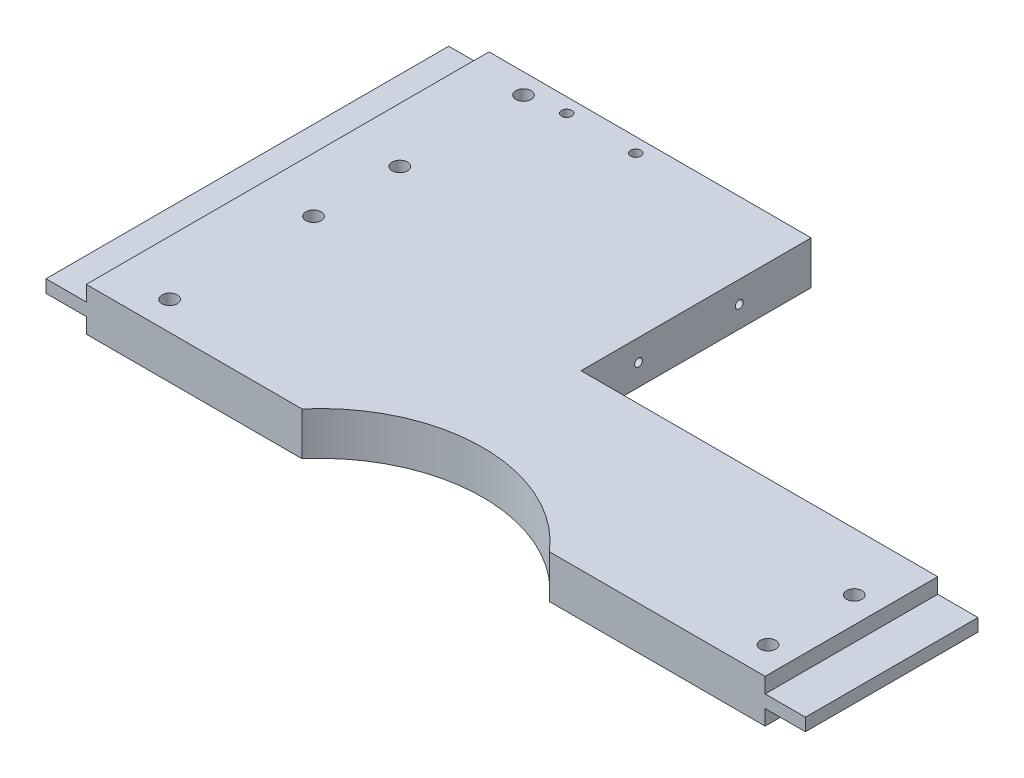
ISO-10303-21;
HEADER;
FILE_DESCRIPTION(('STEP AP214'),'2;1');
FILE_NAME('part.step','',(''),(''),'','','');
FILE_SCHEMA(('AUTOMOTIVE_DESIGN { 1 0 10303 214 1 1 1 1 }'));
ENDSEC;
DATA;
#1=APPLICATION_CONTEXT('core data for automotive mechanical design processes');
#2=APPLICATION_PROTOCOL_DEFINITION('international standard','automotive_design',2000,#1);
#3=PRODUCT_CONTEXT('',#1,'mechanical');
#4=PRODUCT('Part','Part','',(#3));
#5=PRODUCT_RELATED_PRODUCT_CATEGORY('part','',(#4));
#6=PRODUCT_DEFINITION_FORMATION('','',#4);
#7=PRODUCT_DEFINITION_CONTEXT('part definition',#1,'design');
#8=PRODUCT_DEFINITION('design','',#6,#7);
#9=PRODUCT_DEFINITION_SHAPE('','',#8);
#10=(LENGTH_UNIT() NAMED_UNIT(*) SI_UNIT(.MILLI.,.METRE.));
#11=(NAMED_UNIT(*) PLANE_ANGLE_UNIT() SI_UNIT($,.RADIAN.));
#12=(NAMED_UNIT(*) SI_UNIT($,.STERADIAN.) SOLID_ANGLE_UNIT());
#13=UNCERTAINTY_MEASURE_WITH_UNIT(LENGTH_MEASURE(1.E-05),#10,'distance_accuracy_value','');
#14=(GEOMETRIC_REPRESENTATION_CONTEXT(3) GLOBAL_UNCERTAINTY_ASSIGNED_CONTEXT((#13)) GLOBAL_UNIT_ASSIGNED_CONTEXT((#10,
#11,#12)) REPRESENTATION_CONTEXT('',''));
#15=CARTESIAN_POINT('',(0.,0.,0.));
#16=DIRECTION('',(0.,0.,1.));
#17=DIRECTION('',(1.,0.,0.));
#18=AXIS2_PLACEMENT_3D('',#15,#16,#17);
#19=CARTESIAN_POINT('',(157.48,9.525,0.));
#20=DIRECTION('',(1.,0.,0.));
#21=DIRECTION('',(0.,0.,-1.));
#22=AXIS2_PLACEMENT_3D('',#19,#20,#21);
#23=PLANE('',#22);
#24=DIRECTION('',(0.,-1.,0.));
#25=VECTOR('',#24,1.);
#26=CARTESIAN_POINT('',(157.48,9.525,0.));
#27=LINE('',#26,#25);
#28=CARTESIAN_POINT('',(157.48,-2.794,0.));
#29=VERTEX_POINT('',#28);
#30=CARTESIAN_POINT('',(157.48,-9.525,0.));
#31=VERTEX_POINT('',#30);
#32=EDGE_CURVE('E68',#29,#31,#27,.T.);
#33=ORIENTED_EDGE('',*,*,#32,.F.);
#34=DIRECTION('',(0.,0.,1.));
#35=VECTOR('',#34,1.);
#36=CARTESIAN_POINT('',(157.48,-2.794,0.));
#37=LINE('',#36,#35);
#38=CARTESIAN_POINT('',(157.48,-2.794,76.2));
#39=VERTEX_POINT('',#38);
#40=EDGE_CURVE('E63',#29,#39,#37,.T.);
#41=ORIENTED_EDGE('',*,*,#40,.T.);
#42=DIRECTION('',(0.,-1.,0.));
#43=VECTOR('',#42,1.);
#44=CARTESIAN_POINT('',(157.48,9.525,76.2));
#45=LINE('',#44,#43);
#46=CARTESIAN_POINT('',(157.48,-9.525,76.2));
#47=VERTEX_POINT('',#46);
#48=EDGE_CURVE('E447',#39,#47,#45,.T.);
#49=ORIENTED_EDGE('',*,*,#48,.T.);
#50=DIRECTION('',(0.,0.,1.));
#51=VECTOR('',#50,1.);
#52=CARTESIAN_POINT('',(157.48,-9.525,0.));
#53=LINE('',#52,#51);
#54=EDGE_CURVE('E404',#31,#47,#53,.T.);
#55=ORIENTED_EDGE('',*,*,#54,.F.);
#56=EDGE_LOOP('',(#33,#41,#49,#55));
#57=FACE_BOUND('',#56,.T.);
#58=ADVANCED_FACE('F47',(#57),#23,.T.);
#59=CARTESIAN_POINT('',(-142.24,9.525,0.));
#60=DIRECTION('',(1.,0.,0.));
#61=DIRECTION('',(0.,0.,-1.));
#62=AXIS2_PLACEMENT_3D('',#59,#60,#61);
#63=PLANE('',#62);
#64=DIRECTION('',(0.,0.,-1.));
#65=VECTOR('',#64,1.);
#66=CARTESIAN_POINT('',(-142.24,2.794,-101.6));
#67=LINE('',#66,#65);
#68=CARTESIAN_POINT('',(-142.24,2.794,76.2));
#69=VERTEX_POINT('',#68);
#70=CARTESIAN_POINT('',(-142.24,2.794,-101.6));
#71=VERTEX_POINT('',#70);
#72=EDGE_CURVE('E330',#69,#71,#67,.T.);
#73=ORIENTED_EDGE('',*,*,#72,.F.);
#74=DIRECTION('',(0.,-1.,0.));
#75=VECTOR('',#74,1.);
#76=CARTESIAN_POINT('',(-142.24,9.525,76.2));
#77=LINE('',#76,#75);
#78=CARTESIAN_POINT('',(-142.24,9.525,76.2));
#79=VERTEX_POINT('',#78);
#80=EDGE_CURVE('E430',#79,#69,#77,.T.);
#81=ORIENTED_EDGE('',*,*,#80,.F.);
#82=DIRECTION('',(0.,0.,1.));
#83=VECTOR('',#82,1.);
#84=CARTESIAN_POINT('',(-142.24,9.525,0.));
#85=LINE('',#84,#83);
#86=CARTESIAN_POINT('',(-142.24,9.525,-101.6));
#87=VERTEX_POINT('',#86);
#88=EDGE_CURVE('E390',#87,#79,#85,.T.);
#89=ORIENTED_EDGE('',*,*,#88,.F.);
#90=DIRECTION('',(0.,-1.,0.));
#91=VECTOR('',#90,1.);
#92=CARTESIAN_POINT('',(-142.24,9.525,-101.6));
#93=LINE('',#92,#91);
#94=EDGE_CURVE('E435',#87,#71,#93,.T.);
#95=ORIENTED_EDGE('',*,*,#94,.T.);
#96=EDGE_LOOP('',(#73,#81,#89,#95));
#97=FACE_BOUND('',#96,.T.);
#98=ADVANCED_FACE('F491',(#97),#63,.F.);
#99=CARTESIAN_POINT('',(7.62000000000005,9.525,122.820200991416));
#100=DIRECTION('',(0.,-1.,0.));
#101=DIRECTION('',(0.,0.,-1.));
#102=AXIS2_PLACEMENT_3D('',#99,#100,#101);
#103=CYLINDRICAL_SURFACE('',#102,71.8031701283446);
#104=CARTESIAN_POINT('',(7.62000000000005,-9.525,122.820200991416));
#105=DIRECTION('',(0.,1.,0.));
#106=DIRECTION('',(0.,0.,1.));
#107=AXIS2_PLACEMENT_3D('',#104,#105,#106);
#108=CIRCLE('',#107,71.8031701283446);
#109=CARTESIAN_POINT('',(62.23,-9.525,76.2));
#110=VERTEX_POINT('',#109);
#111=CARTESIAN_POINT('',(-46.99,-9.525,76.2));
#112=VERTEX_POINT('',#111);
#113=EDGE_CURVE('E364',#110,#112,#108,.T.);
#114=ORIENTED_EDGE('',*,*,#113,.F.);
#115=DIRECTION('',(0.,-1.,0.));
#116=VECTOR('',#115,1.);
#117=CARTESIAN_POINT('',(62.23,9.525,76.2));
#118=LINE('',#117,#116);
#119=CARTESIAN_POINT('',(62.23,9.525,76.2));
#120=VERTEX_POINT('',#119);
#121=EDGE_CURVE('E11',#120,#110,#118,.T.);
#122=ORIENTED_EDGE('',*,*,#121,.F.);
#123=CARTESIAN_POINT('',(7.62000000000005,9.525,122.820200991416));
#124=DIRECTION('',(0.,1.,0.));
#125=DIRECTION('',(0.,0.,1.));
#126=AXIS2_PLACEMENT_3D('',#123,#124,#125);
#127=CIRCLE('',#126,71.8031701283446);
#128=CARTESIAN_POINT('',(-46.99,9.525,76.2));
#129=VERTEX_POINT('',#128);
#130=EDGE_CURVE('E365',#120,#129,#127,.T.);
#131=ORIENTED_EDGE('',*,*,#130,.T.);
#132=DIRECTION('',(0.,-1.,0.));
#133=VECTOR('',#132,1.);
#134=CARTESIAN_POINT('',(-46.99,9.525,76.2));
#135=LINE('',#134,#133);
#136=EDGE_CURVE('E396',#129,#112,#135,.T.);
#137=ORIENTED_EDGE('',*,*,#136,.T.);
#138=EDGE_LOOP('',(#114,#122,#131,#137));
#139=FACE_BOUND('',#138,.T.);
#140=ADVANCED_FACE('F49',(#139),#103,.F.);
#141=CARTESIAN_POINT('',(0.,9.525,76.2));
#142=DIRECTION('',(0.,0.,1.));
#143=DIRECTION('',(1.,0.,0.));
#144=AXIS2_PLACEMENT_3D('',#141,#142,#143);
#145=PLANE('',#144);
#146=DIRECTION('',(-1.,0.,0.));
#147=VECTOR('',#146,1.);
#148=CARTESIAN_POINT('',(0.,-9.525,76.2));
#149=LINE('',#148,#147);
#150=EDGE_CURVE('E400',#47,#110,#149,.T.);
#151=ORIENTED_EDGE('',*,*,#150,.F.);
#152=ORIENTED_EDGE('',*,*,#48,.F.);
#153=DIRECTION('',(1.,0.,0.));
#154=VECTOR('',#153,1.);
#155=CARTESIAN_POINT('',(157.48,-2.794,76.2));
#156=LINE('',#155,#154);
#157=CARTESIAN_POINT('',(175.26,-2.794,76.2));
#158=VERTEX_POINT('',#157);
#159=EDGE_CURVE('E314',#39,#158,#156,.T.);
#160=ORIENTED_EDGE('',*,*,#159,.T.);
#161=DIRECTION('',(0.,-1.,0.));
#162=VECTOR('',#161,1.);
#163=CARTESIAN_POINT('',(175.26,2.794,76.2));
#164=LINE('',#163,#162);
#165=CARTESIAN_POINT('',(175.26,2.794,76.2));
#166=VERTEX_POINT('',#165);
#167=EDGE_CURVE('E325',#166,#158,#164,.T.);
#168=ORIENTED_EDGE('',*,*,#167,.F.);
#169=DIRECTION('',(1.,0.,0.));
#170=VECTOR('',#169,1.);
#171=CARTESIAN_POINT('',(157.48,2.794,76.2));
#172=LINE('',#171,#170);
#173=CARTESIAN_POINT('',(157.48,2.794,76.2));
#174=VERTEX_POINT('',#173);
#175=EDGE_CURVE('E300',#174,#166,#172,.T.);
#176=ORIENTED_EDGE('',*,*,#175,.F.);
#177=CARTESIAN_POINT('',(157.48,9.525,76.2));
#178=VERTEX_POINT('',#177);
#179=EDGE_CURVE('E56',#178,#174,#45,.T.);
#180=ORIENTED_EDGE('',*,*,#179,.F.);
#181=DIRECTION('',(-1.,0.,0.));
#182=VECTOR('',#181,1.);
#183=CARTESIAN_POINT('',(0.,9.525,76.2));
#184=LINE('',#183,#182);
#185=EDGE_CURVE('E369',#178,#120,#184,.T.);
#186=ORIENTED_EDGE('',*,*,#185,.T.);
#187=ORIENTED_EDGE('',*,*,#121,.T.);
#188=EDGE_LOOP('',(#151,#152,#160,#168,#176,#180,#186,#187));
#189=FACE_BOUND('',#188,.T.);
#190=ADVANCED_FACE('F455',(#189),#145,.T.);
#191=DIRECTION('',(0.,0.,1.));
#192=VECTOR('',#191,1.);
#193=CARTESIAN_POINT('',(157.48,2.794,0.));
#194=LINE('',#193,#192);
#195=CARTESIAN_POINT('',(157.48,2.794,0.));
#196=VERTEX_POINT('',#195);
#197=EDGE_CURVE('E296',#196,#174,#194,.T.);
#198=ORIENTED_EDGE('',*,*,#197,.F.);
#199=CARTESIAN_POINT('',(157.48,9.525,0.));
#200=VERTEX_POINT('',#199);
#201=EDGE_CURVE('E444',#200,#196,#27,.T.);
#202=ORIENTED_EDGE('',*,*,#201,.F.);
#203=DIRECTION('',(0.,0.,1.));
#204=VECTOR('',#203,1.);
#205=CARTESIAN_POINT('',(157.48,9.525,0.));
#206=LINE('',#205,#204);
#207=EDGE_CURVE('E374',#200,#178,#206,.T.);
#208=ORIENTED_EDGE('',*,*,#207,.T.);
#209=ORIENTED_EDGE('',*,*,#179,.T.);
#210=EDGE_LOOP('',(#198,#202,#208,#209));
#211=FACE_BOUND('',#210,.T.);
#212=ADVANCED_FACE('F519',(#211),#23,.T.);
#213=CARTESIAN_POINT('',(0.,9.525,0.));
#214=DIRECTION('',(0.,0.,-1.));
#215=DIRECTION('',(-1.,0.,0.));
#216=AXIS2_PLACEMENT_3D('',#213,#214,#215);
#217=PLANE('',#216);
#218=CARTESIAN_POINT('',(137.16,0.,0.));
#219=DIRECTION('',(0.,0.,-1.));
#220=DIRECTION('',(-1.,0.,0.));
#221=AXIS2_PLACEMENT_3D('',#218,#219,#220);
#222=CIRCLE('',#221,1.72719999999998);
#223=CARTESIAN_POINT('',(135.4328,0.,0.));
#224=VERTEX_POINT('',#223);
#225=EDGE_CURVE('E200',#224,#224,#222,.T.);
#226=ORIENTED_EDGE('',*,*,#225,.F.);
#227=EDGE_LOOP('',(#226));
#228=FACE_BOUND('',#227,.T.);
#229=CARTESIAN_POINT('',(106.68,0.,0.));
#230=DIRECTION('',(0.,0.,-1.));
#231=DIRECTION('',(-1.,0.,0.));
#232=AXIS2_PLACEMENT_3D('',#229,#230,#231);
#233=CIRCLE('',#232,1.72719999999998);
#234=CARTESIAN_POINT('',(104.9528,0.,0.));
#235=VERTEX_POINT('',#234);
#236=EDGE_CURVE('E208',#235,#235,#233,.T.);
#237=ORIENTED_EDGE('',*,*,#236,.F.);
#238=EDGE_LOOP('',(#237));
#239=FACE_BOUND('',#238,.T.);
#240=CARTESIAN_POINT('',(55.88,0.,0.));
#241=DIRECTION('',(0.,0.,-1.));
#242=DIRECTION('',(-1.,0.,0.));
#243=AXIS2_PLACEMENT_3D('',#240,#241,#242);
#244=CIRCLE('',#243,1.72719999999999);
#245=CARTESIAN_POINT('',(54.1528,0.,0.));
#246=VERTEX_POINT('',#245);
#247=EDGE_CURVE('E216',#246,#246,#244,.T.);
#248=ORIENTED_EDGE('',*,*,#247,.F.);
#249=EDGE_LOOP('',(#248));
#250=FACE_BOUND('',#249,.T.);
#251=CARTESIAN_POINT('',(15.24,0.,0.));
#252=DIRECTION('',(0.,0.,-1.));
#253=DIRECTION('',(-1.,0.,0.));
#254=AXIS2_PLACEMENT_3D('',#251,#252,#253);
#255=CIRCLE('',#254,1.72719999999999);
#256=CARTESIAN_POINT('',(13.5128,0.,0.));
#257=VERTEX_POINT('',#256);
#258=EDGE_CURVE('E224',#257,#257,#255,.T.);
#259=ORIENTED_EDGE('',*,*,#258,.F.);
#260=EDGE_LOOP('',(#259));
#261=FACE_BOUND('',#260,.T.);
#262=DIRECTION('',(1.,0.,0.));
#263=VECTOR('',#262,1.);
#264=CARTESIAN_POINT('',(0.,-9.525,0.));
#265=LINE('',#264,#263);
#266=CARTESIAN_POINT('',(0.,-9.525,0.));
#267=VERTEX_POINT('',#266);
#268=EDGE_CURVE('E408',#267,#31,#265,.T.);
#269=ORIENTED_EDGE('',*,*,#268,.F.);
#270=DIRECTION('',(0.,-1.,0.));
#271=VECTOR('',#270,1.);
#272=CARTESIAN_POINT('',(0.,9.525,0.));
#273=LINE('',#272,#271);
#274=CARTESIAN_POINT('',(0.,9.525,0.));
#275=VERTEX_POINT('',#274);
#276=EDGE_CURVE('E441',#275,#267,#273,.T.);
#277=ORIENTED_EDGE('',*,*,#276,.F.);
#278=DIRECTION('',(1.,0.,0.));
#279=VECTOR('',#278,1.);
#280=CARTESIAN_POINT('',(0.,9.525,0.));
#281=LINE('',#280,#279);
#282=EDGE_CURVE('E378',#275,#200,#281,.T.);
#283=ORIENTED_EDGE('',*,*,#282,.T.);
#284=ORIENTED_EDGE('',*,*,#201,.T.);
#285=DIRECTION('',(-1.,0.,0.));
#286=VECTOR('',#285,1.);
#287=CARTESIAN_POINT('',(157.48,2.794,0.));
#288=LINE('',#287,#286);
#289=CARTESIAN_POINT('',(175.26,2.794,0.));
#290=VERTEX_POINT('',#289);
#291=EDGE_CURVE('E307',#290,#196,#288,.T.);
#292=ORIENTED_EDGE('',*,*,#291,.F.);
#293=DIRECTION('',(0.,-1.,0.));
#294=VECTOR('',#293,1.);
#295=CARTESIAN_POINT('',(175.26,2.794,0.));
#296=LINE('',#295,#294);
#297=CARTESIAN_POINT('',(175.26,-2.794,0.));
#298=VERTEX_POINT('',#297);
#299=EDGE_CURVE('E311',#290,#298,#296,.T.);
#300=ORIENTED_EDGE('',*,*,#299,.T.);
#301=DIRECTION('',(-1.,0.,0.));
#302=VECTOR('',#301,1.);
#303=CARTESIAN_POINT('',(157.48,-2.794,0.));
#304=LINE('',#303,#302);
#305=EDGE_CURVE('E301',#298,#29,#304,.T.);
#306=ORIENTED_EDGE('',*,*,#305,.T.);
#307=ORIENTED_EDGE('',*,*,#32,.T.);
#308=EDGE_LOOP('',(#269,#277,#283,#284,#292,#300,#306,#307));
#309=FACE_BOUND('',#308,.T.);
#310=ADVANCED_FACE('F462',(#228,#239,#250,#261,#309),#217,.T.);
#311=CARTESIAN_POINT('',(0.,9.525,0.));
#312=DIRECTION('',(1.,0.,0.));
#313=DIRECTION('',(0.,0.,-1.));
#314=AXIS2_PLACEMENT_3D('',#311,#312,#313);
#315=PLANE('',#314);
#316=CARTESIAN_POINT('',(0.,0.,-69.85));
#317=DIRECTION('',(1.,0.,0.));
#318=DIRECTION('',(0.,0.,-1.));
#319=AXIS2_PLACEMENT_3D('',#316,#317,#318);
#320=CIRCLE('',#319,1.72719999999999);
#321=CARTESIAN_POINT('',(0.,0.,-71.5772));
#322=VERTEX_POINT('',#321);
#323=EDGE_CURVE('E187',#322,#322,#320,.T.);
#324=ORIENTED_EDGE('',*,*,#323,.F.);
#325=EDGE_LOOP('',(#324));
#326=FACE_BOUND('',#325,.T.);
#327=CARTESIAN_POINT('',(0.,0.,-25.4));
#328=DIRECTION('',(1.,0.,0.));
#329=DIRECTION('',(0.,0.,-1.));
#330=AXIS2_PLACEMENT_3D('',#327,#328,#329);
#331=CIRCLE('',#330,1.72719999999999);
#332=CARTESIAN_POINT('',(0.,0.,-27.1272));
#333=VERTEX_POINT('',#332);
#334=EDGE_CURVE('E186',#333,#333,#331,.T.);
#335=ORIENTED_EDGE('',*,*,#334,.F.);
#336=EDGE_LOOP('',(#335));
#337=FACE_BOUND('',#336,.T.);
#338=DIRECTION('',(0.,0.,1.));
#339=VECTOR('',#338,1.);
#340=CARTESIAN_POINT('',(0.,-9.525,0.));
#341=LINE('',#340,#339);
#342=CARTESIAN_POINT('',(0.,-9.525,-101.6));
#343=VERTEX_POINT('',#342);
#344=EDGE_CURVE('E412',#343,#267,#341,.T.);
#345=ORIENTED_EDGE('',*,*,#344,.F.);
#346=DIRECTION('',(0.,-1.,0.));
#347=VECTOR('',#346,1.);
#348=CARTESIAN_POINT('',(0.,9.525,-101.6));
#349=LINE('',#348,#347);
#350=CARTESIAN_POINT('',(0.,9.525,-101.6));
#351=VERTEX_POINT('',#350);
#352=EDGE_CURVE('E438',#351,#343,#349,.T.);
#353=ORIENTED_EDGE('',*,*,#352,.F.);
#354=DIRECTION('',(0.,0.,1.));
#355=VECTOR('',#354,1.);
#356=CARTESIAN_POINT('',(0.,9.525,0.));
#357=LINE('',#356,#355);
#358=EDGE_CURVE('E382',#351,#275,#357,.T.);
#359=ORIENTED_EDGE('',*,*,#358,.T.);
#360=ORIENTED_EDGE('',*,*,#276,.T.);
#361=EDGE_LOOP('',(#345,#353,#359,#360));
#362=FACE_BOUND('',#361,.T.);
#363=ADVANCED_FACE('F506',(#326,#337,#362),#315,.T.);
#364=CARTESIAN_POINT('',(0.,9.525,-101.6));
#365=DIRECTION('',(0.,0.,-1.));
#366=DIRECTION('',(-1.,0.,0.));
#367=AXIS2_PLACEMENT_3D('',#364,#365,#366);
#368=PLANE('',#367);
#369=DIRECTION('',(1.,0.,0.));
#370=VECTOR('',#369,1.);
#371=CARTESIAN_POINT('',(0.,-9.525,-101.6));
#372=LINE('',#371,#370);
#373=CARTESIAN_POINT('',(-142.24,-9.525,-101.6));
#374=VERTEX_POINT('',#373);
#375=EDGE_CURVE('E416',#374,#343,#372,.T.);
#376=ORIENTED_EDGE('',*,*,#375,.F.);
#377=CARTESIAN_POINT('',(-142.24,-2.794,-101.6));
#378=VERTEX_POINT('',#377);
#379=EDGE_CURVE('E434',#378,#374,#93,.T.);
#380=ORIENTED_EDGE('',*,*,#379,.F.);
#381=DIRECTION('',(-1.,0.,0.));
#382=VECTOR('',#381,1.);
#383=CARTESIAN_POINT('',(-142.24,-2.794,-101.6));
#384=LINE('',#383,#382);
#385=CARTESIAN_POINT('',(-160.02,-2.794,-101.6));
#386=VERTEX_POINT('',#385);
#387=EDGE_CURVE('E348',#378,#386,#384,.T.);
#388=ORIENTED_EDGE('',*,*,#387,.T.);
#389=DIRECTION('',(0.,-1.,0.));
#390=VECTOR('',#389,1.);
#391=CARTESIAN_POINT('',(-160.02,2.794,-101.6));
#392=LINE('',#391,#390);
#393=CARTESIAN_POINT('',(-160.02,2.794,-101.6));
#394=VERTEX_POINT('',#393);
#395=EDGE_CURVE('E360',#394,#386,#392,.T.);
#396=ORIENTED_EDGE('',*,*,#395,.F.);
#397=DIRECTION('',(-1.,0.,0.));
#398=VECTOR('',#397,1.);
#399=CARTESIAN_POINT('',(-142.24,2.794,-101.6));
#400=LINE('',#399,#398);
#401=EDGE_CURVE('E334',#71,#394,#400,.T.);
#402=ORIENTED_EDGE('',*,*,#401,.F.);
#403=ORIENTED_EDGE('',*,*,#94,.F.);
#404=DIRECTION('',(1.,0.,0.));
#405=VECTOR('',#404,1.);
#406=CARTESIAN_POINT('',(0.,9.525,-101.6));
#407=LINE('',#406,#405);
#408=EDGE_CURVE('E386',#87,#351,#407,.T.);
#409=ORIENTED_EDGE('',*,*,#408,.T.);
#410=ORIENTED_EDGE('',*,*,#352,.T.);
#411=EDGE_LOOP('',(#376,#380,#388,#396,#402,#403,#409,#410));
#412=FACE_BOUND('',#411,.T.);
#413=ADVANCED_FACE('F504',(#412),#368,.T.);
#414=CARTESIAN_POINT('',(-142.24,-2.794,76.2));
#415=VERTEX_POINT('',#414);
#416=CARTESIAN_POINT('',(-142.24,-9.525,76.2));
#417=VERTEX_POINT('',#416);
#418=EDGE_CURVE('E429',#415,#417,#77,.T.);
#419=ORIENTED_EDGE('',*,*,#418,.F.);
#420=DIRECTION('',(0.,0.,-1.));
#421=VECTOR('',#420,1.);
#422=CARTESIAN_POINT('',(-142.24,-2.794,-101.6));
#423=LINE('',#422,#421);
#424=EDGE_CURVE('E329',#415,#378,#423,.T.);
#425=ORIENTED_EDGE('',*,*,#424,.T.);
#426=ORIENTED_EDGE('',*,*,#379,.T.);
#427=DIRECTION('',(0.,0.,1.));
#428=VECTOR('',#427,1.);
#429=CARTESIAN_POINT('',(-142.24,-9.525,0.));
#430=LINE('',#429,#428);
#431=EDGE_CURVE('E420',#374,#417,#430,.T.);
#432=ORIENTED_EDGE('',*,*,#431,.T.);
#433=EDGE_LOOP('',(#419,#425,#426,#432));
#434=FACE_BOUND('',#433,.T.);
#435=ADVANCED_FACE('F476',(#434),#63,.F.);
#436=CARTESIAN_POINT('',(0.,9.525,76.2));
#437=DIRECTION('',(0.,0.,-1.));
#438=DIRECTION('',(-1.,0.,0.));
#439=AXIS2_PLACEMENT_3D('',#436,#437,#438);
#440=PLANE('',#439);
#441=DIRECTION('',(1.,0.,0.));
#442=VECTOR('',#441,1.);
#443=CARTESIAN_POINT('',(0.,-9.525,76.2));
#444=LINE('',#443,#442);
#445=EDGE_CURVE('E370',#417,#112,#444,.T.);
#446=ORIENTED_EDGE('',*,*,#445,.T.);
#447=ORIENTED_EDGE('',*,*,#136,.F.);
#448=DIRECTION('',(1.,0.,0.));
#449=VECTOR('',#448,1.);
#450=CARTESIAN_POINT('',(0.,9.525,76.2));
#451=LINE('',#450,#449);
#452=EDGE_CURVE('E393',#79,#129,#451,.T.);
#453=ORIENTED_EDGE('',*,*,#452,.F.);
#454=ORIENTED_EDGE('',*,*,#80,.T.);
#455=DIRECTION('',(1.,0.,0.));
#456=VECTOR('',#455,1.);
#457=CARTESIAN_POINT('',(-142.24,2.794,76.2000000000001));
#458=LINE('',#457,#456);
#459=CARTESIAN_POINT('',(-160.02,2.794,76.2));
#460=VERTEX_POINT('',#459);
#461=EDGE_CURVE('E341',#460,#69,#458,.T.);
#462=ORIENTED_EDGE('',*,*,#461,.F.);
#463=DIRECTION('',(0.,-1.,0.));
#464=VECTOR('',#463,1.);
#465=CARTESIAN_POINT('',(-160.02,2.794,76.2));
#466=LINE('',#465,#464);
#467=CARTESIAN_POINT('',(-160.02,-2.794,76.2));
#468=VERTEX_POINT('',#467);
#469=EDGE_CURVE('E345',#460,#468,#466,.T.);
#470=ORIENTED_EDGE('',*,*,#469,.T.);
#471=DIRECTION('',(1.,0.,0.));
#472=VECTOR('',#471,1.);
#473=CARTESIAN_POINT('',(-142.24,-2.794,76.2000000000001));
#474=LINE('',#473,#472);
#475=EDGE_CURVE('E335',#468,#415,#474,.T.);
#476=ORIENTED_EDGE('',*,*,#475,.T.);
#477=ORIENTED_EDGE('',*,*,#418,.T.);
#478=EDGE_LOOP('',(#446,#447,#453,#454,#462,#470,#476,#477));
#479=FACE_BOUND('',#478,.T.);
#480=ADVANCED_FACE('F469',(#479),#440,.F.);
#481=CARTESIAN_POINT('',(0.,9.525,0.));
#482=DIRECTION('',(0.,1.,0.));
#483=DIRECTION('',(0.,0.,1.));
#484=AXIS2_PLACEMENT_3D('',#481,#482,#483);
#485=PLANE('',#484);
#486=CARTESIAN_POINT('',(146.05,9.525,25.4));
#487=DIRECTION('',(0.,1.,0.));
#488=DIRECTION('',(0.,0.,1.));
#489=AXIS2_PLACEMENT_3D('',#486,#487,#488);
#490=CIRCLE('',#489,3.3782);
#491=CARTESIAN_POINT('',(146.05,9.525,28.7782));
#492=VERTEX_POINT('',#491);
#493=EDGE_CURVE('E232',#492,#492,#490,.T.);
#494=ORIENTED_EDGE('',*,*,#493,.F.);
#495=EDGE_LOOP('',(#494));
#496=FACE_BOUND('',#495,.T.);
#497=CARTESIAN_POINT('',(146.05,9.525,63.5));
#498=DIRECTION('',(0.,1.,0.));
#499=DIRECTION('',(0.,0.,1.));
#500=AXIS2_PLACEMENT_3D('',#497,#498,#499);
#501=CIRCLE('',#500,3.3782);
#502=CARTESIAN_POINT('',(146.05,9.525,66.8782));
#503=VERTEX_POINT('',#502);
#504=EDGE_CURVE('E240',#503,#503,#501,.T.);
#505=ORIENTED_EDGE('',*,*,#504,.F.);
#506=EDGE_LOOP('',(#505));
#507=FACE_BOUND('',#506,.T.);
#508=CARTESIAN_POINT('',(-101.6,9.525,-95.25));
#509=DIRECTION('',(0.,1.,0.));
#510=DIRECTION('',(0.,0.,1.));
#511=AXIS2_PLACEMENT_3D('',#508,#509,#510);
#512=CIRCLE('',#511,2.2479);
#513=CARTESIAN_POINT('',(-101.6,9.525,-93.0021));
#514=VERTEX_POINT('',#513);
#515=EDGE_CURVE('E248',#514,#514,#512,.T.);
#516=ORIENTED_EDGE('',*,*,#515,.F.);
#517=EDGE_LOOP('',(#516));
#518=FACE_BOUND('',#517,.T.);
#519=CARTESIAN_POINT('',(-71.12,9.525,-95.25));
#520=DIRECTION('',(0.,1.,0.));
#521=DIRECTION('',(0.,0.,1.));
#522=AXIS2_PLACEMENT_3D('',#519,#520,#521);
#523=CIRCLE('',#522,2.2479);
#524=CARTESIAN_POINT('',(-71.12,9.525,-93.0021));
#525=VERTEX_POINT('',#524);
#526=EDGE_CURVE('E256',#525,#525,#523,.T.);
#527=ORIENTED_EDGE('',*,*,#526,.F.);
#528=EDGE_LOOP('',(#527));
#529=FACE_BOUND('',#528,.T.);
#530=CARTESIAN_POINT('',(-118.11,9.525,-92.71));
#531=DIRECTION('',(0.,1.,0.));
#532=DIRECTION('',(0.,0.,1.));
#533=AXIS2_PLACEMENT_3D('',#530,#531,#532);
#534=CIRCLE('',#533,3.3782);
#535=CARTESIAN_POINT('',(-118.11,9.525,-89.3318));
#536=VERTEX_POINT('',#535);
#537=EDGE_CURVE('E264',#536,#536,#534,.T.);
#538=ORIENTED_EDGE('',*,*,#537,.F.);
#539=EDGE_LOOP('',(#538));
#540=FACE_BOUND('',#539,.T.);
#541=CARTESIAN_POINT('',(-118.11,9.525,-38.1));
#542=DIRECTION('',(0.,1.,0.));
#543=DIRECTION('',(0.,0.,1.));
#544=AXIS2_PLACEMENT_3D('',#541,#542,#543);
#545=CIRCLE('',#544,3.3782);
#546=CARTESIAN_POINT('',(-118.11,9.525,-34.7218));
#547=VERTEX_POINT('',#546);
#548=EDGE_CURVE('E272',#547,#547,#545,.T.);
#549=ORIENTED_EDGE('',*,*,#548,.F.);
#550=EDGE_LOOP('',(#549));
#551=FACE_BOUND('',#550,.T.);
#552=CARTESIAN_POINT('',(-118.11,9.525,0.));
#553=DIRECTION('',(0.,1.,0.));
#554=DIRECTION('',(0.,0.,1.));
#555=AXIS2_PLACEMENT_3D('',#552,#553,#554);
#556=CIRCLE('',#555,3.3782);
#557=CARTESIAN_POINT('',(-118.11,9.525,3.37820000000004));
#558=VERTEX_POINT('',#557);
#559=EDGE_CURVE('E280',#558,#558,#556,.T.);
#560=ORIENTED_EDGE('',*,*,#559,.F.);
#561=EDGE_LOOP('',(#560));
#562=FACE_BOUND('',#561,.T.);
#563=CARTESIAN_POINT('',(-118.11,9.525,63.5));
#564=DIRECTION('',(0.,1.,0.));
#565=DIRECTION('',(0.,0.,1.));
#566=AXIS2_PLACEMENT_3D('',#563,#564,#565);
#567=CIRCLE('',#566,3.3782);
#568=CARTESIAN_POINT('',(-118.11,9.525,66.8782));
#569=VERTEX_POINT('',#568);
#570=EDGE_CURVE('E288',#569,#569,#567,.T.);
#571=ORIENTED_EDGE('',*,*,#570,.F.);
#572=EDGE_LOOP('',(#571));
#573=FACE_BOUND('',#572,.T.);
#574=ORIENTED_EDGE('',*,*,#130,.F.);
#575=ORIENTED_EDGE('',*,*,#185,.F.);
#576=ORIENTED_EDGE('',*,*,#207,.F.);
#577=ORIENTED_EDGE('',*,*,#282,.F.);
#578=ORIENTED_EDGE('',*,*,#358,.F.);
#579=ORIENTED_EDGE('',*,*,#408,.F.);
#580=ORIENTED_EDGE('',*,*,#88,.T.);
#581=ORIENTED_EDGE('',*,*,#452,.T.);
#582=EDGE_LOOP('',(#574,#575,#576,#577,#578,#579,#580,#581));
#583=FACE_BOUND('',#582,.T.);
#584=ADVANCED_FACE('F485',(#496,#507,#518,#529,#540,#551,#562,#573,#583),#485,.T.);
#585=CARTESIAN_POINT('',(0.,-9.525,0.));
#586=DIRECTION('',(0.,1.,0.));
#587=DIRECTION('',(0.,0.,1.));
#588=AXIS2_PLACEMENT_3D('',#585,#586,#587);
#589=PLANE('',#588);
#590=CARTESIAN_POINT('',(146.05,-9.525,25.4));
#591=DIRECTION('',(0.,1.,0.));
#592=DIRECTION('',(0.,0.,1.));
#593=AXIS2_PLACEMENT_3D('',#590,#591,#592);
#594=CIRCLE('',#593,3.3782);
#595=CARTESIAN_POINT('',(146.05,-9.525,28.7782));
#596=VERTEX_POINT('',#595);
#597=EDGE_CURVE('E236',#596,#596,#594,.T.);
#598=ORIENTED_EDGE('',*,*,#597,.T.);
#599=EDGE_LOOP('',(#598));
#600=FACE_BOUND('',#599,.T.);
#601=CARTESIAN_POINT('',(146.05,-9.525,63.5));
#602=DIRECTION('',(0.,1.,0.));
#603=DIRECTION('',(0.,0.,1.));
#604=AXIS2_PLACEMENT_3D('',#601,#602,#603);
#605=CIRCLE('',#604,3.3782);
#606=CARTESIAN_POINT('',(146.05,-9.525,66.8782));
#607=VERTEX_POINT('',#606);
#608=EDGE_CURVE('E244',#607,#607,#605,.T.);
#609=ORIENTED_EDGE('',*,*,#608,.T.);
#610=EDGE_LOOP('',(#609));
#611=FACE_BOUND('',#610,.T.);
#612=CARTESIAN_POINT('',(-101.6,-9.525,-95.25));
#613=DIRECTION('',(0.,1.,0.));
#614=DIRECTION('',(0.,0.,1.));
#615=AXIS2_PLACEMENT_3D('',#612,#613,#614);
#616=CIRCLE('',#615,2.2479);
#617=CARTESIAN_POINT('',(-101.6,-9.525,-93.0021));
#618=VERTEX_POINT('',#617);
#619=EDGE_CURVE('E252',#618,#618,#616,.T.);
#620=ORIENTED_EDGE('',*,*,#619,.T.);
#621=EDGE_LOOP('',(#620));
#622=FACE_BOUND('',#621,.T.);
#623=CARTESIAN_POINT('',(-71.12,-9.525,-95.25));
#624=DIRECTION('',(0.,1.,0.));
#625=DIRECTION('',(0.,0.,1.));
#626=AXIS2_PLACEMENT_3D('',#623,#624,#625);
#627=CIRCLE('',#626,2.2479);
#628=CARTESIAN_POINT('',(-71.12,-9.525,-93.0021));
#629=VERTEX_POINT('',#628);
#630=EDGE_CURVE('E260',#629,#629,#627,.T.);
#631=ORIENTED_EDGE('',*,*,#630,.T.);
#632=EDGE_LOOP('',(#631));
#633=FACE_BOUND('',#632,.T.);
#634=CARTESIAN_POINT('',(-118.11,-9.525,-92.71));
#635=DIRECTION('',(0.,1.,0.));
#636=DIRECTION('',(0.,0.,1.));
#637=AXIS2_PLACEMENT_3D('',#634,#635,#636);
#638=CIRCLE('',#637,3.3782);
#639=CARTESIAN_POINT('',(-118.11,-9.525,-89.3318));
#640=VERTEX_POINT('',#639);
#641=EDGE_CURVE('E268',#640,#640,#638,.T.);
#642=ORIENTED_EDGE('',*,*,#641,.T.);
#643=EDGE_LOOP('',(#642));
#644=FACE_BOUND('',#643,.T.);
#645=CARTESIAN_POINT('',(-118.11,-9.525,-38.1));
#646=DIRECTION('',(0.,1.,0.));
#647=DIRECTION('',(0.,0.,1.));
#648=AXIS2_PLACEMENT_3D('',#645,#646,#647);
#649=CIRCLE('',#648,3.3782);
#650=CARTESIAN_POINT('',(-118.11,-9.525,-34.7218));
#651=VERTEX_POINT('',#650);
#652=EDGE_CURVE('E276',#651,#651,#649,.T.);
#653=ORIENTED_EDGE('',*,*,#652,.T.);
#654=EDGE_LOOP('',(#653));
#655=FACE_BOUND('',#654,.T.);
#656=CARTESIAN_POINT('',(-118.11,-9.525,0.));
#657=DIRECTION('',(0.,1.,0.));
#658=DIRECTION('',(0.,0.,1.));
#659=AXIS2_PLACEMENT_3D('',#656,#657,#658);
#660=CIRCLE('',#659,3.3782);
#661=CARTESIAN_POINT('',(-118.11,-9.525,3.37820000000004));
#662=VERTEX_POINT('',#661);
#663=EDGE_CURVE('E284',#662,#662,#660,.T.);
#664=ORIENTED_EDGE('',*,*,#663,.T.);
#665=EDGE_LOOP('',(#664));
#666=FACE_BOUND('',#665,.T.);
#667=CARTESIAN_POINT('',(-118.11,-9.525,63.5));
#668=DIRECTION('',(0.,1.,0.));
#669=DIRECTION('',(0.,0.,1.));
#670=AXIS2_PLACEMENT_3D('',#667,#668,#669);
#671=CIRCLE('',#670,3.3782);
#672=CARTESIAN_POINT('',(-118.11,-9.525,66.8782));
#673=VERTEX_POINT('',#672);
#674=EDGE_CURVE('E292',#673,#673,#671,.T.);
#675=ORIENTED_EDGE('',*,*,#674,.T.);
#676=EDGE_LOOP('',(#675));
#677=FACE_BOUND('',#676,.T.);
#678=ORIENTED_EDGE('',*,*,#113,.T.);
#679=ORIENTED_EDGE('',*,*,#445,.F.);
#680=ORIENTED_EDGE('',*,*,#431,.F.);
#681=ORIENTED_EDGE('',*,*,#375,.T.);
#682=ORIENTED_EDGE('',*,*,#344,.T.);
#683=ORIENTED_EDGE('',*,*,#268,.T.);
#684=ORIENTED_EDGE('',*,*,#54,.T.);
#685=ORIENTED_EDGE('',*,*,#150,.T.);
#686=EDGE_LOOP('',(#678,#679,#680,#681,#682,#683,#684,#685));
#687=FACE_BOUND('',#686,.T.);
#688=ADVANCED_FACE('F458',(#600,#611,#622,#633,#644,#655,#666,#677,#687),#589,.F.);
#689=CARTESIAN_POINT('',(-160.02,2.794,-101.6));
#690=DIRECTION('',(1.,0.,0.));
#691=DIRECTION('',(0.,0.,-1.));
#692=AXIS2_PLACEMENT_3D('',#689,#690,#691);
#693=PLANE('',#692);
#694=DIRECTION('',(0.,0.,1.));
#695=VECTOR('',#694,1.);
#696=CARTESIAN_POINT('',(-160.02,-2.794,-101.6));
#697=LINE('',#696,#695);
#698=EDGE_CURVE('E351',#386,#468,#697,.T.);
#699=ORIENTED_EDGE('',*,*,#698,.T.);
#700=ORIENTED_EDGE('',*,*,#469,.F.);
#701=DIRECTION('',(0.,0.,1.));
#702=VECTOR('',#701,1.);
#703=CARTESIAN_POINT('',(-160.02,2.794,-101.6));
#704=LINE('',#703,#702);
#705=EDGE_CURVE('E338',#394,#460,#704,.T.);
#706=ORIENTED_EDGE('',*,*,#705,.F.);
#707=ORIENTED_EDGE('',*,*,#395,.T.);
#708=EDGE_LOOP('',(#699,#700,#706,#707));
#709=FACE_BOUND('',#708,.T.);
#710=ADVANCED_FACE('F638',(#709),#693,.F.);
#711=CARTESIAN_POINT('',(0.,2.794,0.));
#712=DIRECTION('',(0.,-1.,0.));
#713=DIRECTION('',(0.,0.,-1.));
#714=AXIS2_PLACEMENT_3D('',#711,#712,#713);
#715=PLANE('',#714);
#716=ORIENTED_EDGE('',*,*,#72,.T.);
#717=ORIENTED_EDGE('',*,*,#401,.T.);
#718=ORIENTED_EDGE('',*,*,#705,.T.);
#719=ORIENTED_EDGE('',*,*,#461,.T.);
#720=EDGE_LOOP('',(#716,#717,#718,#719));
#721=FACE_BOUND('',#720,.T.);
#722=ADVANCED_FACE('F494',(#721),#715,.F.);
#723=CARTESIAN_POINT('',(0.,-2.794,0.));
#724=DIRECTION('',(0.,-1.,0.));
#725=DIRECTION('',(0.,0.,-1.));
#726=AXIS2_PLACEMENT_3D('',#723,#724,#725);
#727=PLANE('',#726);
#728=ORIENTED_EDGE('',*,*,#424,.F.);
#729=ORIENTED_EDGE('',*,*,#475,.F.);
#730=ORIENTED_EDGE('',*,*,#698,.F.);
#731=ORIENTED_EDGE('',*,*,#387,.F.);
#732=EDGE_LOOP('',(#728,#729,#730,#731));
#733=FACE_BOUND('',#732,.T.);
#734=ADVANCED_FACE('F501',(#733),#727,.T.);
#735=CARTESIAN_POINT('',(175.26,2.794,0.));
#736=DIRECTION('',(-1.,0.,0.));
#737=DIRECTION('',(0.,0.,1.));
#738=AXIS2_PLACEMENT_3D('',#735,#736,#737);
#739=PLANE('',#738);
#740=DIRECTION('',(0.,0.,-1.));
#741=VECTOR('',#740,1.);
#742=CARTESIAN_POINT('',(175.26,-2.794,0.));
#743=LINE('',#742,#741);
#744=EDGE_CURVE('E317',#158,#298,#743,.T.);
#745=ORIENTED_EDGE('',*,*,#744,.T.);
#746=ORIENTED_EDGE('',*,*,#299,.F.);
#747=DIRECTION('',(0.,0.,-1.));
#748=VECTOR('',#747,1.);
#749=CARTESIAN_POINT('',(175.26,2.794,0.));
#750=LINE('',#749,#748);
#751=EDGE_CURVE('E304',#166,#290,#750,.T.);
#752=ORIENTED_EDGE('',*,*,#751,.F.);
#753=ORIENTED_EDGE('',*,*,#167,.T.);
#754=EDGE_LOOP('',(#745,#746,#752,#753));
#755=FACE_BOUND('',#754,.T.);
#756=ADVANCED_FACE('F515',(#755),#739,.F.);
#757=CARTESIAN_POINT('',(0.,2.794,0.));
#758=DIRECTION('',(0.,1.,0.));
#759=DIRECTION('',(0.,0.,1.));
#760=AXIS2_PLACEMENT_3D('',#757,#758,#759);
#761=PLANE('',#760);
#762=ORIENTED_EDGE('',*,*,#197,.T.);
#763=ORIENTED_EDGE('',*,*,#175,.T.);
#764=ORIENTED_EDGE('',*,*,#751,.T.);
#765=ORIENTED_EDGE('',*,*,#291,.T.);
#766=EDGE_LOOP('',(#762,#763,#764,#765));
#767=FACE_BOUND('',#766,.T.);
#768=ADVANCED_FACE('F510',(#767),#761,.T.);
#769=CARTESIAN_POINT('',(0.,-2.794,0.));
#770=DIRECTION('',(0.,1.,0.));
#771=DIRECTION('',(0.,0.,1.));
#772=AXIS2_PLACEMENT_3D('',#769,#770,#771);
#773=PLANE('',#772);
#774=ORIENTED_EDGE('',*,*,#40,.F.);
#775=ORIENTED_EDGE('',*,*,#305,.F.);
#776=ORIENTED_EDGE('',*,*,#744,.F.);
#777=ORIENTED_EDGE('',*,*,#159,.F.);
#778=EDGE_LOOP('',(#774,#775,#776,#777));
#779=FACE_BOUND('',#778,.T.);
#780=ADVANCED_FACE('F518',(#779),#773,.F.);
#781=CARTESIAN_POINT('',(-118.11,9.525,63.5));
#782=DIRECTION('',(0.,1.,0.));
#783=DIRECTION('',(0.,0.,1.));
#784=AXIS2_PLACEMENT_3D('',#781,#782,#783);
#785=CYLINDRICAL_SURFACE('',#784,3.3782);
#786=ORIENTED_EDGE('',*,*,#674,.F.);
#787=EDGE_LOOP('',(#786));
#788=FACE_BOUND('',#787,.T.);
#789=ORIENTED_EDGE('',*,*,#570,.T.);
#790=EDGE_LOOP('',(#789));
#791=FACE_BOUND('',#790,.T.);
#792=ADVANCED_FACE('F625',(#788,#791),#785,.F.);
#793=CARTESIAN_POINT('',(-118.11,9.525,0.));
#794=DIRECTION('',(0.,1.,0.));
#795=DIRECTION('',(0.,0.,1.));
#796=AXIS2_PLACEMENT_3D('',#793,#794,#795);
#797=CYLINDRICAL_SURFACE('',#796,3.3782);
#798=ORIENTED_EDGE('',*,*,#663,.F.);
#799=EDGE_LOOP('',(#798));
#800=FACE_BOUND('',#799,.T.);
#801=ORIENTED_EDGE('',*,*,#559,.T.);
#802=EDGE_LOOP('',(#801));
#803=FACE_BOUND('',#802,.T.);
#804=ADVANCED_FACE('F621',(#800,#803),#797,.F.);
#805=CARTESIAN_POINT('',(-118.11,9.525,-38.1));
#806=DIRECTION('',(0.,1.,0.));
#807=DIRECTION('',(0.,0.,1.));
#808=AXIS2_PLACEMENT_3D('',#805,#806,#807);
#809=CYLINDRICAL_SURFACE('',#808,3.3782);
#810=ORIENTED_EDGE('',*,*,#652,.F.);
#811=EDGE_LOOP('',(#810));
#812=FACE_BOUND('',#811,.T.);
#813=ORIENTED_EDGE('',*,*,#548,.T.);
#814=EDGE_LOOP('',(#813));
#815=FACE_BOUND('',#814,.T.);
#816=ADVANCED_FACE('F617',(#812,#815),#809,.F.);
#817=CARTESIAN_POINT('',(-118.11,9.525,-92.71));
#818=DIRECTION('',(0.,1.,0.));
#819=DIRECTION('',(0.,0.,1.));
#820=AXIS2_PLACEMENT_3D('',#817,#818,#819);
#821=CYLINDRICAL_SURFACE('',#820,3.3782);
#822=ORIENTED_EDGE('',*,*,#641,.F.);
#823=EDGE_LOOP('',(#822));
#824=FACE_BOUND('',#823,.T.);
#825=ORIENTED_EDGE('',*,*,#537,.T.);
#826=EDGE_LOOP('',(#825));
#827=FACE_BOUND('',#826,.T.);
#828=ADVANCED_FACE('F613',(#824,#827),#821,.F.);
#829=CARTESIAN_POINT('',(-71.12,9.525,-95.25));
#830=DIRECTION('',(0.,1.,0.));
#831=DIRECTION('',(0.,0.,1.));
#832=AXIS2_PLACEMENT_3D('',#829,#830,#831);
#833=CYLINDRICAL_SURFACE('',#832,2.2479);
#834=ORIENTED_EDGE('',*,*,#630,.F.);
#835=EDGE_LOOP('',(#834));
#836=FACE_BOUND('',#835,.T.);
#837=ORIENTED_EDGE('',*,*,#526,.T.);
#838=EDGE_LOOP('',(#837));
#839=FACE_BOUND('',#838,.T.);
#840=ADVANCED_FACE('F609',(#836,#839),#833,.F.);
#841=CARTESIAN_POINT('',(-101.6,9.525,-95.25));
#842=DIRECTION('',(0.,1.,0.));
#843=DIRECTION('',(0.,0.,1.));
#844=AXIS2_PLACEMENT_3D('',#841,#842,#843);
#845=CYLINDRICAL_SURFACE('',#844,2.2479);
#846=ORIENTED_EDGE('',*,*,#619,.F.);
#847=EDGE_LOOP('',(#846));
#848=FACE_BOUND('',#847,.T.);
#849=ORIENTED_EDGE('',*,*,#515,.T.);
#850=EDGE_LOOP('',(#849));
#851=FACE_BOUND('',#850,.T.);
#852=ADVANCED_FACE('F605',(#848,#851),#845,.F.);
#853=CARTESIAN_POINT('',(146.05,9.525,63.5));
#854=DIRECTION('',(0.,1.,0.));
#855=DIRECTION('',(0.,0.,1.));
#856=AXIS2_PLACEMENT_3D('',#853,#854,#855);
#857=CYLINDRICAL_SURFACE('',#856,3.3782);
#858=ORIENTED_EDGE('',*,*,#608,.F.);
#859=EDGE_LOOP('',(#858));
#860=FACE_BOUND('',#859,.T.);
#861=ORIENTED_EDGE('',*,*,#504,.T.);
#862=EDGE_LOOP('',(#861));
#863=FACE_BOUND('',#862,.T.);
#864=ADVANCED_FACE('F601',(#860,#863),#857,.F.);
#865=CARTESIAN_POINT('',(146.05,9.525,25.4));
#866=DIRECTION('',(0.,1.,0.));
#867=DIRECTION('',(0.,0.,1.));
#868=AXIS2_PLACEMENT_3D('',#865,#866,#867);
#869=CYLINDRICAL_SURFACE('',#868,3.3782);
#870=ORIENTED_EDGE('',*,*,#597,.F.);
#871=EDGE_LOOP('',(#870));
#872=FACE_BOUND('',#871,.T.);
#873=ORIENTED_EDGE('',*,*,#493,.T.);
#874=EDGE_LOOP('',(#873));
#875=FACE_BOUND('',#874,.T.);
#876=ADVANCED_FACE('F597',(#872,#875),#869,.F.);
#877=CARTESIAN_POINT('',(15.24,0.,10.668));
#878=DIRECTION('',(0.,0.,-1.));
#879=DIRECTION('',(-1.,0.,0.));
#880=AXIS2_PLACEMENT_3D('',#877,#878,#879);
#881=CONICAL_SURFACE('',#880,1.72719999999999,1.02974425867665);
#882=CARTESIAN_POINT('',(15.24,0.,11.7058064611844));
#883=VERTEX_POINT('',#882);
#884=VERTEX_LOOP('',#883);
#885=FACE_BOUND('',#884,.T.);
#886=CARTESIAN_POINT('',(15.24,0.,10.668));
#887=DIRECTION('',(0.,0.,-1.));
#888=DIRECTION('',(-1.,0.,0.));
#889=AXIS2_PLACEMENT_3D('',#886,#887,#888);
#890=CIRCLE('',#889,1.72719999999999);
#891=CARTESIAN_POINT('',(13.5128,0.,10.668));
#892=VERTEX_POINT('',#891);
#893=EDGE_CURVE('E228',#892,#892,#890,.T.);
#894=ORIENTED_EDGE('',*,*,#893,.T.);
#895=EDGE_LOOP('',(#894));
#896=FACE_BOUND('',#895,.T.);
#897=ADVANCED_FACE('F593',(#885,#896),#881,.F.);
#898=CARTESIAN_POINT('',(15.24,0.,0.));
#899=DIRECTION('',(0.,0.,-1.));
#900=DIRECTION('',(-1.,0.,0.));
#901=AXIS2_PLACEMENT_3D('',#898,#899,#900);
#902=CYLINDRICAL_SURFACE('',#901,1.72719999999999);
#903=ORIENTED_EDGE('',*,*,#893,.F.);
#904=EDGE_LOOP('',(#903));
#905=FACE_BOUND('',#904,.T.);
#906=ORIENTED_EDGE('',*,*,#258,.T.);
#907=EDGE_LOOP('',(#906));
#908=FACE_BOUND('',#907,.T.);
#909=ADVANCED_FACE('F589',(#905,#908),#902,.F.);
#910=CARTESIAN_POINT('',(55.88,0.,10.668));
#911=DIRECTION('',(0.,0.,-1.));
#912=DIRECTION('',(-1.,0.,0.));
#913=AXIS2_PLACEMENT_3D('',#910,#911,#912);
#914=CONICAL_SURFACE('',#913,1.72719999999998,1.02974425867665);
#915=CARTESIAN_POINT('',(55.88,0.,11.7058064611844));
#916=VERTEX_POINT('',#915);
#917=VERTEX_LOOP('',#916);
#918=FACE_BOUND('',#917,.T.);
#919=CARTESIAN_POINT('',(55.88,0.,10.668));
#920=DIRECTION('',(0.,0.,-1.));
#921=DIRECTION('',(-1.,0.,0.));
#922=AXIS2_PLACEMENT_3D('',#919,#920,#921);
#923=CIRCLE('',#922,1.72719999999998);
#924=CARTESIAN_POINT('',(54.1528,0.,10.668));
#925=VERTEX_POINT('',#924);
#926=EDGE_CURVE('E220',#925,#925,#923,.T.);
#927=ORIENTED_EDGE('',*,*,#926,.T.);
#928=EDGE_LOOP('',(#927));
#929=FACE_BOUND('',#928,.T.);
#930=ADVANCED_FACE('F585',(#918,#929),#914,.F.);
#931=CARTESIAN_POINT('',(55.88,0.,0.));
#932=DIRECTION('',(0.,0.,-1.));
#933=DIRECTION('',(-1.,0.,0.));
#934=AXIS2_PLACEMENT_3D('',#931,#932,#933);
#935=CYLINDRICAL_SURFACE('',#934,1.72719999999999);
#936=ORIENTED_EDGE('',*,*,#926,.F.);
#937=EDGE_LOOP('',(#936));
#938=FACE_BOUND('',#937,.T.);
#939=ORIENTED_EDGE('',*,*,#247,.T.);
#940=EDGE_LOOP('',(#939));
#941=FACE_BOUND('',#940,.T.);
#942=ADVANCED_FACE('F581',(#938,#941),#935,.F.);
#943=CARTESIAN_POINT('',(106.68,0.,10.668));
#944=DIRECTION('',(0.,0.,-1.));
#945=DIRECTION('',(-1.,0.,0.));
#946=AXIS2_PLACEMENT_3D('',#943,#944,#945);
#947=CONICAL_SURFACE('',#946,1.72719999999998,1.02974425867665);
#948=CARTESIAN_POINT('',(106.68,0.,11.7058064611844));
#949=VERTEX_POINT('',#948);
#950=VERTEX_LOOP('',#949);
#951=FACE_BOUND('',#950,.T.);
#952=CARTESIAN_POINT('',(106.68,0.,10.668));
#953=DIRECTION('',(0.,0.,-1.));
#954=DIRECTION('',(-1.,0.,0.));
#955=AXIS2_PLACEMENT_3D('',#952,#953,#954);
#956=CIRCLE('',#955,1.72719999999998);
#957=CARTESIAN_POINT('',(104.9528,0.,10.668));
#958=VERTEX_POINT('',#957);
#959=EDGE_CURVE('E212',#958,#958,#956,.T.);
#960=ORIENTED_EDGE('',*,*,#959,.T.);
#961=EDGE_LOOP('',(#960));
#962=FACE_BOUND('',#961,.T.);
#963=ADVANCED_FACE('F577',(#951,#962),#947,.F.);
#964=CARTESIAN_POINT('',(106.68,0.,0.));
#965=DIRECTION('',(0.,0.,-1.));
#966=DIRECTION('',(-1.,0.,0.));
#967=AXIS2_PLACEMENT_3D('',#964,#965,#966);
#968=CYLINDRICAL_SURFACE('',#967,1.72719999999998);
#969=ORIENTED_EDGE('',*,*,#959,.F.);
#970=EDGE_LOOP('',(#969));
#971=FACE_BOUND('',#970,.T.);
#972=ORIENTED_EDGE('',*,*,#236,.T.);
#973=EDGE_LOOP('',(#972));
#974=FACE_BOUND('',#973,.T.);
#975=ADVANCED_FACE('F573',(#971,#974),#968,.F.);
#976=CARTESIAN_POINT('',(137.16,0.,10.668));
#977=DIRECTION('',(0.,0.,-1.));
#978=DIRECTION('',(-1.,0.,0.));
#979=AXIS2_PLACEMENT_3D('',#976,#977,#978);
#980=CONICAL_SURFACE('',#979,1.72719999999998,1.02974425867665);
#981=CARTESIAN_POINT('',(137.16,0.,11.7058064611844));
#982=VERTEX_POINT('',#981);
#983=VERTEX_LOOP('',#982);
#984=FACE_BOUND('',#983,.T.);
#985=CARTESIAN_POINT('',(137.16,0.,10.668));
#986=DIRECTION('',(0.,0.,-1.));
#987=DIRECTION('',(-1.,0.,0.));
#988=AXIS2_PLACEMENT_3D('',#985,#986,#987);
#989=CIRCLE('',#988,1.72719999999998);
#990=CARTESIAN_POINT('',(135.4328,0.,10.668));
#991=VERTEX_POINT('',#990);
#992=EDGE_CURVE('E204',#991,#991,#989,.T.);
#993=ORIENTED_EDGE('',*,*,#992,.T.);
#994=EDGE_LOOP('',(#993));
#995=FACE_BOUND('',#994,.T.);
#996=ADVANCED_FACE('F569',(#984,#995),#980,.F.);
#997=CARTESIAN_POINT('',(137.16,0.,0.));
#998=DIRECTION('',(0.,0.,-1.));
#999=DIRECTION('',(-1.,0.,0.));
#1000=AXIS2_PLACEMENT_3D('',#997,#998,#999);
#1001=CYLINDRICAL_SURFACE('',#1000,1.72719999999998);
#1002=ORIENTED_EDGE('',*,*,#992,.F.);
#1003=EDGE_LOOP('',(#1002));
#1004=FACE_BOUND('',#1003,.T.);
#1005=ORIENTED_EDGE('',*,*,#225,.T.);
#1006=EDGE_LOOP('',(#1005));
#1007=FACE_BOUND('',#1006,.T.);
#1008=ADVANCED_FACE('F561',(#1004,#1007),#1001,.F.);
#1009=CARTESIAN_POINT('',(-10.668,0.,-25.4));
#1010=DIRECTION('',(1.,0.,0.));
#1011=DIRECTION('',(0.,0.,-1.));
#1012=AXIS2_PLACEMENT_3D('',#1009,#1010,#1011);
#1013=CONICAL_SURFACE('',#1012,1.72719999999999,1.02974425867665);
#1014=CARTESIAN_POINT('',(-11.7058064611844,0.,-25.4));
#1015=VERTEX_POINT('',#1014);
#1016=VERTEX_LOOP('',#1015);
#1017=FACE_BOUND('',#1016,.T.);
#1018=CARTESIAN_POINT('',(-10.668,0.,-25.4));
#1019=DIRECTION('',(1.,0.,0.));
#1020=DIRECTION('',(0.,0.,-1.));
#1021=AXIS2_PLACEMENT_3D('',#1018,#1019,#1020);
#1022=CIRCLE('',#1021,1.72719999999999);
#1023=CARTESIAN_POINT('',(-10.668,0.,-27.1272));
#1024=VERTEX_POINT('',#1023);
#1025=EDGE_CURVE('E192',#1024,#1024,#1022,.T.);
#1026=ORIENTED_EDGE('',*,*,#1025,.T.);
#1027=EDGE_LOOP('',(#1026));
#1028=FACE_BOUND('',#1027,.T.);
#1029=ADVANCED_FACE('F555',(#1017,#1028),#1013,.F.);
#1030=CARTESIAN_POINT('',(0.,0.,-25.4));
#1031=DIRECTION('',(1.,0.,0.));
#1032=DIRECTION('',(0.,0.,-1.));
#1033=AXIS2_PLACEMENT_3D('',#1030,#1031,#1032);
#1034=CYLINDRICAL_SURFACE('',#1033,1.72719999999999);
#1035=ORIENTED_EDGE('',*,*,#1025,.F.);
#1036=EDGE_LOOP('',(#1035));
#1037=FACE_BOUND('',#1036,.T.);
#1038=ORIENTED_EDGE('',*,*,#334,.T.);
#1039=EDGE_LOOP('',(#1038));
#1040=FACE_BOUND('',#1039,.T.);
#1041=ADVANCED_FACE('F179',(#1037,#1040),#1034,.F.);
#1042=CARTESIAN_POINT('',(-10.668,0.,-69.85));
#1043=DIRECTION('',(1.,0.,0.));
#1044=DIRECTION('',(0.,0.,-1.));
#1045=AXIS2_PLACEMENT_3D('',#1042,#1043,#1044);
#1046=CONICAL_SURFACE('',#1045,1.72719999999999,1.02974425867665);
#1047=CARTESIAN_POINT('',(-11.7058064611844,0.,-69.85));
#1048=VERTEX_POINT('',#1047);
#1049=VERTEX_LOOP('',#1048);
#1050=FACE_BOUND('',#1049,.T.);
#1051=CARTESIAN_POINT('',(-10.668,0.,-69.85));
#1052=DIRECTION('',(1.,0.,0.));
#1053=DIRECTION('',(0.,0.,-1.));
#1054=AXIS2_PLACEMENT_3D('',#1051,#1052,#1053);
#1055=CIRCLE('',#1054,1.72719999999999);
#1056=CARTESIAN_POINT('',(-10.668,0.,-71.5772));
#1057=VERTEX_POINT('',#1056);
#1058=EDGE_CURVE('E183',#1057,#1057,#1055,.T.);
#1059=ORIENTED_EDGE('',*,*,#1058,.T.);
#1060=EDGE_LOOP('',(#1059));
#1061=FACE_BOUND('',#1060,.T.);
#1062=ADVANCED_FACE('F175',(#1050,#1061),#1046,.F.);
#1063=CARTESIAN_POINT('',(0.,0.,-69.85));
#1064=DIRECTION('',(1.,0.,0.));
#1065=DIRECTION('',(0.,0.,-1.));
#1066=AXIS2_PLACEMENT_3D('',#1063,#1064,#1065);
#1067=CYLINDRICAL_SURFACE('',#1066,1.72719999999999);
#1068=ORIENTED_EDGE('',*,*,#1058,.F.);
#1069=EDGE_LOOP('',(#1068));
#1070=FACE_BOUND('',#1069,.T.);
#1071=ORIENTED_EDGE('',*,*,#323,.T.);
#1072=EDGE_LOOP('',(#1071));
#1073=FACE_BOUND('',#1072,.T.);
#1074=ADVANCED_FACE('F178',(#1070,#1073),#1067,.F.);
#1075=CLOSED_SHELL('',(#58,#98,#140,#190,#212,#310,#363,#413,#435,#480,#584,#688,#710,#722,#734,
#756,#768,#780,#792,#804,#816,#828,#840,#852,#864,#876,#897,#909,#930,#942,#963,#975,#996,#1008,
#1029,#1041,#1062,#1074));
#1076=MANIFOLD_SOLID_BREP('B2',#1075);
#1077=ADVANCED_BREP_SHAPE_REPRESENTATION('',(#18,#1076),#14);
#1078=SHAPE_DEFINITION_REPRESENTATION(#9,#1077);
ENDSEC;
END-ISO-10303-21;
